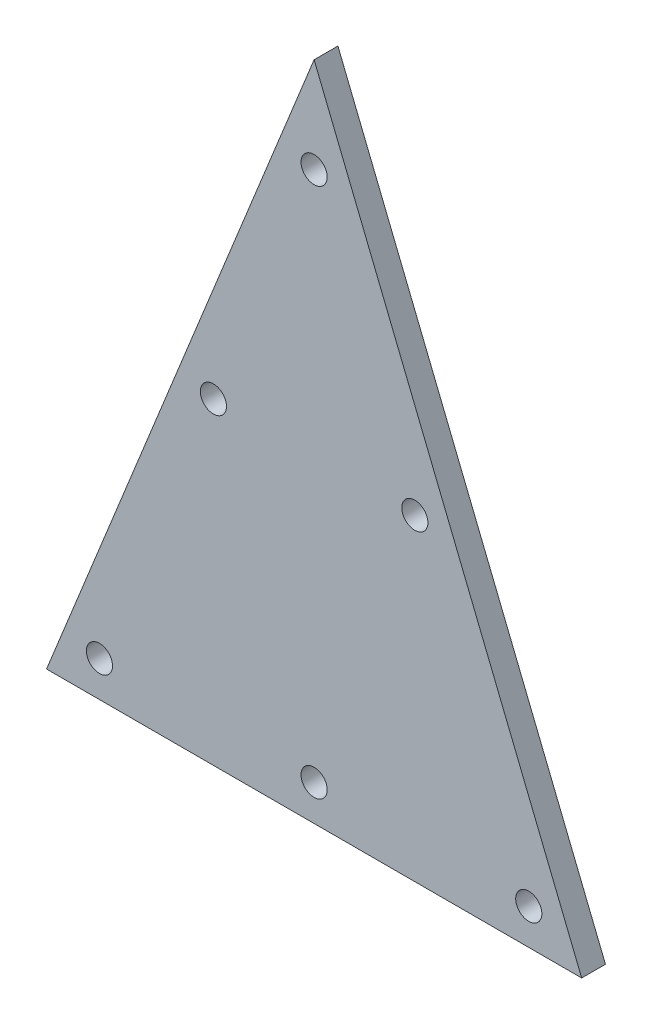
ISO-10303-21;
HEADER;
FILE_DESCRIPTION(('STEP AP214'),'2;1');
FILE_NAME('part.step','',(''),(''),'','','');
FILE_SCHEMA(('AUTOMOTIVE_DESIGN { 1 0 10303 214 1 1 1 1 }'));
ENDSEC;
DATA;
#1=APPLICATION_CONTEXT('core data for automotive mechanical design processes');
#2=APPLICATION_PROTOCOL_DEFINITION('international standard','automotive_design',2000,#1);
#3=PRODUCT_CONTEXT('',#1,'mechanical');
#4=PRODUCT('Part','Part','',(#3));
#5=PRODUCT_RELATED_PRODUCT_CATEGORY('part','',(#4));
#6=PRODUCT_DEFINITION_FORMATION('','',#4);
#7=PRODUCT_DEFINITION_CONTEXT('part definition',#1,'design');
#8=PRODUCT_DEFINITION('design','',#6,#7);
#9=PRODUCT_DEFINITION_SHAPE('','',#8);
#10=(LENGTH_UNIT() NAMED_UNIT(*) SI_UNIT(.MILLI.,.METRE.));
#11=(NAMED_UNIT(*) PLANE_ANGLE_UNIT() SI_UNIT($,.RADIAN.));
#12=(NAMED_UNIT(*) SI_UNIT($,.STERADIAN.) SOLID_ANGLE_UNIT());
#13=UNCERTAINTY_MEASURE_WITH_UNIT(LENGTH_MEASURE(1.E-05),#10,'distance_accuracy_value','');
#14=(GEOMETRIC_REPRESENTATION_CONTEXT(3) GLOBAL_UNCERTAINTY_ASSIGNED_CONTEXT((#13)) GLOBAL_UNIT_ASSIGNED_CONTEXT((#10,
#11,#12)) REPRESENTATION_CONTEXT('',''));
#15=CARTESIAN_POINT('',(0.,0.,0.));
#16=DIRECTION('',(0.,0.,1.));
#17=DIRECTION('',(1.,0.,0.));
#18=AXIS2_PLACEMENT_3D('',#15,#16,#17);
#19=CARTESIAN_POINT('',(0.,0.,2.));
#20=DIRECTION('',(0.,0.,1.));
#21=DIRECTION('',(1.,0.,0.));
#22=AXIS2_PLACEMENT_3D('',#19,#20,#21);
#23=PLANE('',#22);
#24=CARTESIAN_POINT('',(22.5,47.6214886532175,2.));
#25=DIRECTION('',(0.,0.,1.));
#26=DIRECTION('',(1.,0.,0.));
#27=AXIS2_PLACEMENT_3D('',#24,#25,#26);
#28=CIRCLE('',#27,1.1);
#29=CARTESIAN_POINT('',(23.6,47.6214886532175,2.));
#30=VERTEX_POINT('',#29);
#31=EDGE_CURVE('E118',#30,#30,#28,.T.);
#32=ORIENTED_EDGE('',*,*,#31,.F.);
#33=EDGE_LOOP('',(#32));
#34=FACE_BOUND('',#33,.T.);
#35=CARTESIAN_POINT('',(30.9689255673391,26.6857443266087,2.));
#36=DIRECTION('',(0.,0.,1.));
#37=DIRECTION('',(1.,0.,0.));
#38=AXIS2_PLACEMENT_3D('',#35,#36,#37);
#39=CIRCLE('',#38,1.1);
#40=CARTESIAN_POINT('',(32.0689255673391,26.6857443266087,2.));
#41=VERTEX_POINT('',#40);
#42=EDGE_CURVE('E128',#41,#41,#39,.T.);
#43=ORIENTED_EDGE('',*,*,#42,.F.);
#44=EDGE_LOOP('',(#43));
#45=FACE_BOUND('',#44,.T.);
#46=CARTESIAN_POINT('',(22.5,3.,2.));
#47=DIRECTION('',(0.,0.,1.));
#48=DIRECTION('',(1.,0.,0.));
#49=AXIS2_PLACEMENT_3D('',#46,#47,#48);
#50=CIRCLE('',#49,1.1);
#51=CARTESIAN_POINT('',(23.6,3.,2.));
#52=VERTEX_POINT('',#51);
#53=EDGE_CURVE('E85',#52,#52,#50,.T.);
#54=ORIENTED_EDGE('',*,*,#53,.F.);
#55=EDGE_LOOP('',(#54));
#56=FACE_BOUND('',#55,.T.);
#57=DIRECTION('',(-0.375,-0.927024810886958,0.));
#58=VECTOR('',#57,1.);
#59=CARTESIAN_POINT('',(22.5,55.6214886532175,2.));
#60=LINE('',#59,#58);
#61=CARTESIAN_POINT('',(22.5,55.6214886532175,2.));
#62=VERTEX_POINT('',#61);
#63=CARTESIAN_POINT('',(0.,0.,2.));
#64=VERTEX_POINT('',#63);
#65=EDGE_CURVE('E75',#62,#64,#60,.T.);
#66=ORIENTED_EDGE('',*,*,#65,.T.);
#67=DIRECTION('',(1.,0.,0.));
#68=VECTOR('',#67,1.);
#69=CARTESIAN_POINT('',(0.,0.,2.));
#70=LINE('',#69,#68);
#71=CARTESIAN_POINT('',(45.,0.,2.));
#72=VERTEX_POINT('',#71);
#73=EDGE_CURVE('E71',#64,#72,#70,.T.);
#74=ORIENTED_EDGE('',*,*,#73,.T.);
#75=DIRECTION('',(-0.375,0.927024810886958,0.));
#76=VECTOR('',#75,1.);
#77=CARTESIAN_POINT('',(45.,0.,2.));
#78=LINE('',#77,#76);
#79=EDGE_CURVE('E51',#72,#62,#78,.T.);
#80=ORIENTED_EDGE('',*,*,#79,.T.);
#81=EDGE_LOOP('',(#66,#74,#80));
#82=FACE_BOUND('',#81,.T.);
#83=CARTESIAN_POINT('',(14.0310744326609,26.6857443266087,2.));
#84=DIRECTION('',(0.,0.,1.));
#85=DIRECTION('',(1.,0.,0.));
#86=AXIS2_PLACEMENT_3D('',#83,#84,#85);
#87=CIRCLE('',#86,1.1);
#88=CARTESIAN_POINT('',(15.1310744326609,26.6857443266087,2.));
#89=VERTEX_POINT('',#88);
#90=EDGE_CURVE('E133',#89,#89,#87,.T.);
#91=ORIENTED_EDGE('',*,*,#90,.F.);
#92=EDGE_LOOP('',(#91));
#93=FACE_BOUND('',#92,.T.);
#94=CARTESIAN_POINT('',(4.4497190922574,3.,2.));
#95=DIRECTION('',(0.,0.,1.));
#96=DIRECTION('',(1.,0.,0.));
#97=AXIS2_PLACEMENT_3D('',#94,#95,#96);
#98=CIRCLE('',#97,1.1);
#99=CARTESIAN_POINT('',(5.5497190922574,3.,2.));
#100=VERTEX_POINT('',#99);
#101=EDGE_CURVE('E123',#100,#100,#98,.T.);
#102=ORIENTED_EDGE('',*,*,#101,.F.);
#103=EDGE_LOOP('',(#102));
#104=FACE_BOUND('',#103,.T.);
#105=CARTESIAN_POINT('',(40.5502809077426,3.,2.));
#106=DIRECTION('',(0.,0.,1.));
#107=DIRECTION('',(1.,0.,0.));
#108=AXIS2_PLACEMENT_3D('',#105,#106,#107);
#109=CIRCLE('',#108,1.1);
#110=CARTESIAN_POINT('',(41.6502809077426,3.,2.));
#111=VERTEX_POINT('',#110);
#112=EDGE_CURVE('E112',#111,#111,#109,.T.);
#113=ORIENTED_EDGE('',*,*,#112,.F.);
#114=EDGE_LOOP('',(#113));
#115=FACE_BOUND('',#114,.T.);
#116=ADVANCED_FACE('F34',(#34,#45,#56,#82,#93,#104,#115),#23,.T.);
#117=CARTESIAN_POINT('',(0.,0.,0.));
#118=DIRECTION('',(0.,0.,1.));
#119=DIRECTION('',(1.,0.,0.));
#120=AXIS2_PLACEMENT_3D('',#117,#118,#119);
#121=PLANE('',#120);
#122=CARTESIAN_POINT('',(22.5,47.6214886532175,0.));
#123=DIRECTION('',(0.,0.,1.));
#124=DIRECTION('',(1.,0.,0.));
#125=AXIS2_PLACEMENT_3D('',#122,#123,#124);
#126=CIRCLE('',#125,1.1);
#127=CARTESIAN_POINT('',(23.6,47.6214886532175,0.));
#128=VERTEX_POINT('',#127);
#129=EDGE_CURVE('E115',#128,#128,#126,.T.);
#130=ORIENTED_EDGE('',*,*,#129,.T.);
#131=EDGE_LOOP('',(#130));
#132=FACE_BOUND('',#131,.T.);
#133=CARTESIAN_POINT('',(30.9689255673391,26.6857443266087,0.));
#134=DIRECTION('',(0.,0.,1.));
#135=DIRECTION('',(1.,0.,0.));
#136=AXIS2_PLACEMENT_3D('',#133,#134,#135);
#137=CIRCLE('',#136,1.1);
#138=CARTESIAN_POINT('',(32.0689255673391,26.6857443266087,0.));
#139=VERTEX_POINT('',#138);
#140=EDGE_CURVE('E126',#139,#139,#137,.T.);
#141=ORIENTED_EDGE('',*,*,#140,.T.);
#142=EDGE_LOOP('',(#141));
#143=FACE_BOUND('',#142,.T.);
#144=CARTESIAN_POINT('',(22.5,3.,0.));
#145=DIRECTION('',(0.,0.,1.));
#146=DIRECTION('',(1.,0.,0.));
#147=AXIS2_PLACEMENT_3D('',#144,#145,#146);
#148=CIRCLE('',#147,1.1);
#149=CARTESIAN_POINT('',(23.6,3.,0.));
#150=VERTEX_POINT('',#149);
#151=EDGE_CURVE('E89',#150,#150,#148,.T.);
#152=ORIENTED_EDGE('',*,*,#151,.T.);
#153=EDGE_LOOP('',(#152));
#154=FACE_BOUND('',#153,.T.);
#155=DIRECTION('',(-0.375,-0.927024810886958,0.));
#156=VECTOR('',#155,1.);
#157=CARTESIAN_POINT('',(22.5,55.6214886532175,0.));
#158=LINE('',#157,#156);
#159=CARTESIAN_POINT('',(22.5,55.6214886532175,0.));
#160=VERTEX_POINT('',#159);
#161=CARTESIAN_POINT('',(0.,0.,0.));
#162=VERTEX_POINT('',#161);
#163=EDGE_CURVE('E82',#160,#162,#158,.T.);
#164=ORIENTED_EDGE('',*,*,#163,.F.);
#165=DIRECTION('',(-0.375,0.927024810886958,0.));
#166=VECTOR('',#165,1.);
#167=CARTESIAN_POINT('',(45.,0.,0.));
#168=LINE('',#167,#166);
#169=CARTESIAN_POINT('',(45.,0.,0.));
#170=VERTEX_POINT('',#169);
#171=EDGE_CURVE('E68',#170,#160,#168,.T.);
#172=ORIENTED_EDGE('',*,*,#171,.F.);
#173=DIRECTION('',(1.,0.,0.));
#174=VECTOR('',#173,1.);
#175=CARTESIAN_POINT('',(0.,0.,0.));
#176=LINE('',#175,#174);
#177=EDGE_CURVE('E63',#162,#170,#176,.T.);
#178=ORIENTED_EDGE('',*,*,#177,.F.);
#179=EDGE_LOOP('',(#164,#172,#178));
#180=FACE_BOUND('',#179,.T.);
#181=CARTESIAN_POINT('',(14.0310744326609,26.6857443266087,0.));
#182=DIRECTION('',(0.,0.,1.));
#183=DIRECTION('',(1.,0.,0.));
#184=AXIS2_PLACEMENT_3D('',#181,#182,#183);
#185=CIRCLE('',#184,1.1);
#186=CARTESIAN_POINT('',(15.1310744326609,26.6857443266087,0.));
#187=VERTEX_POINT('',#186);
#188=EDGE_CURVE('E103',#187,#187,#185,.T.);
#189=ORIENTED_EDGE('',*,*,#188,.T.);
#190=EDGE_LOOP('',(#189));
#191=FACE_BOUND('',#190,.T.);
#192=CARTESIAN_POINT('',(4.4497190922574,3.,0.));
#193=DIRECTION('',(0.,0.,1.));
#194=DIRECTION('',(1.,0.,0.));
#195=AXIS2_PLACEMENT_3D('',#192,#193,#194);
#196=CIRCLE('',#195,1.1);
#197=CARTESIAN_POINT('',(5.5497190922574,3.,0.));
#198=VERTEX_POINT('',#197);
#199=EDGE_CURVE('E107',#198,#198,#196,.T.);
#200=ORIENTED_EDGE('',*,*,#199,.T.);
#201=EDGE_LOOP('',(#200));
#202=FACE_BOUND('',#201,.T.);
#203=CARTESIAN_POINT('',(40.5502809077426,3.,0.));
#204=DIRECTION('',(0.,0.,1.));
#205=DIRECTION('',(1.,0.,0.));
#206=AXIS2_PLACEMENT_3D('',#203,#204,#205);
#207=CIRCLE('',#206,1.1);
#208=CARTESIAN_POINT('',(41.6502809077426,3.,0.));
#209=VERTEX_POINT('',#208);
#210=EDGE_CURVE('E110',#209,#209,#207,.T.);
#211=ORIENTED_EDGE('',*,*,#210,.T.);
#212=EDGE_LOOP('',(#211));
#213=FACE_BOUND('',#212,.T.);
#214=ADVANCED_FACE('F95',(#132,#143,#154,#180,#191,#202,#213),#121,.F.);
#215=CARTESIAN_POINT('',(22.5,55.6214886532175,2.));
#216=DIRECTION('',(0.927024810886958,-0.375,0.));
#217=DIRECTION('',(0.375,0.927024810886958,0.));
#218=AXIS2_PLACEMENT_3D('',#215,#216,#217);
#219=PLANE('',#218);
#220=ORIENTED_EDGE('',*,*,#163,.T.);
#221=DIRECTION('',(0.,0.,-1.));
#222=VECTOR('',#221,1.);
#223=CARTESIAN_POINT('',(0.,0.,2.));
#224=LINE('',#223,#222);
#225=EDGE_CURVE('E11',#64,#162,#224,.T.);
#226=ORIENTED_EDGE('',*,*,#225,.F.);
#227=ORIENTED_EDGE('',*,*,#65,.F.);
#228=DIRECTION('',(0.,0.,-1.));
#229=VECTOR('',#228,1.);
#230=CARTESIAN_POINT('',(22.5,55.6214886532175,2.));
#231=LINE('',#230,#229);
#232=EDGE_CURVE('E83',#62,#160,#231,.T.);
#233=ORIENTED_EDGE('',*,*,#232,.T.);
#234=EDGE_LOOP('',(#220,#226,#227,#233));
#235=FACE_BOUND('',#234,.T.);
#236=ADVANCED_FACE('F36',(#235),#219,.F.);
#237=CARTESIAN_POINT('',(0.,0.,2.));
#238=DIRECTION('',(0.,1.,0.));
#239=DIRECTION('',(0.,0.,1.));
#240=AXIS2_PLACEMENT_3D('',#237,#238,#239);
#241=PLANE('',#240);
#242=ORIENTED_EDGE('',*,*,#177,.T.);
#243=DIRECTION('',(0.,0.,-1.));
#244=VECTOR('',#243,1.);
#245=CARTESIAN_POINT('',(45.,0.,2.));
#246=LINE('',#245,#244);
#247=EDGE_CURVE('E43',#72,#170,#246,.T.);
#248=ORIENTED_EDGE('',*,*,#247,.F.);
#249=ORIENTED_EDGE('',*,*,#73,.F.);
#250=ORIENTED_EDGE('',*,*,#225,.T.);
#251=EDGE_LOOP('',(#242,#248,#249,#250));
#252=FACE_BOUND('',#251,.T.);
#253=ADVANCED_FACE('F72',(#252),#241,.F.);
#254=CARTESIAN_POINT('',(45.,0.,2.));
#255=DIRECTION('',(-0.927024810886958,-0.375,0.));
#256=DIRECTION('',(0.375,-0.927024810886958,0.));
#257=AXIS2_PLACEMENT_3D('',#254,#255,#256);
#258=PLANE('',#257);
#259=ORIENTED_EDGE('',*,*,#171,.T.);
#260=ORIENTED_EDGE('',*,*,#232,.F.);
#261=ORIENTED_EDGE('',*,*,#79,.F.);
#262=ORIENTED_EDGE('',*,*,#247,.T.);
#263=EDGE_LOOP('',(#259,#260,#261,#262));
#264=FACE_BOUND('',#263,.T.);
#265=ADVANCED_FACE('F94',(#264),#258,.F.);
#266=CARTESIAN_POINT('',(22.5,3.,2.));
#267=DIRECTION('',(0.,0.,-1.));
#268=DIRECTION('',(-1.,0.,0.));
#269=AXIS2_PLACEMENT_3D('',#266,#267,#268);
#270=CYLINDRICAL_SURFACE('',#269,1.1);
#271=ORIENTED_EDGE('',*,*,#53,.T.);
#272=EDGE_LOOP('',(#271));
#273=FACE_BOUND('',#272,.T.);
#274=ORIENTED_EDGE('',*,*,#151,.F.);
#275=EDGE_LOOP('',(#274));
#276=FACE_BOUND('',#275,.T.);
#277=ADVANCED_FACE('F141',(#273,#276),#270,.F.);
#278=CARTESIAN_POINT('',(14.0310744326609,26.6857443266087,2.));
#279=DIRECTION('',(0.,0.,-1.));
#280=DIRECTION('',(-1.,0.,0.));
#281=AXIS2_PLACEMENT_3D('',#278,#279,#280);
#282=CYLINDRICAL_SURFACE('',#281,1.1);
#283=ORIENTED_EDGE('',*,*,#90,.T.);
#284=EDGE_LOOP('',(#283));
#285=FACE_BOUND('',#284,.T.);
#286=ORIENTED_EDGE('',*,*,#188,.F.);
#287=EDGE_LOOP('',(#286));
#288=FACE_BOUND('',#287,.T.);
#289=ADVANCED_FACE('F143',(#285,#288),#282,.F.);
#290=CARTESIAN_POINT('',(30.9689255673391,26.6857443266087,2.));
#291=DIRECTION('',(0.,0.,-1.));
#292=DIRECTION('',(-1.,0.,0.));
#293=AXIS2_PLACEMENT_3D('',#290,#291,#292);
#294=CYLINDRICAL_SURFACE('',#293,1.1);
#295=ORIENTED_EDGE('',*,*,#42,.T.);
#296=EDGE_LOOP('',(#295));
#297=FACE_BOUND('',#296,.T.);
#298=ORIENTED_EDGE('',*,*,#140,.F.);
#299=EDGE_LOOP('',(#298));
#300=FACE_BOUND('',#299,.T.);
#301=ADVANCED_FACE('F150',(#297,#300),#294,.F.);
#302=CARTESIAN_POINT('',(4.4497190922574,3.,2.));
#303=DIRECTION('',(0.,0.,-1.));
#304=DIRECTION('',(-1.,0.,0.));
#305=AXIS2_PLACEMENT_3D('',#302,#303,#304);
#306=CYLINDRICAL_SURFACE('',#305,1.1);
#307=ORIENTED_EDGE('',*,*,#101,.T.);
#308=EDGE_LOOP('',(#307));
#309=FACE_BOUND('',#308,.T.);
#310=ORIENTED_EDGE('',*,*,#199,.F.);
#311=EDGE_LOOP('',(#310));
#312=FACE_BOUND('',#311,.T.);
#313=ADVANCED_FACE('F207',(#309,#312),#306,.F.);
#314=CARTESIAN_POINT('',(22.5,47.6214886532175,2.));
#315=DIRECTION('',(0.,0.,-1.));
#316=DIRECTION('',(-1.,0.,0.));
#317=AXIS2_PLACEMENT_3D('',#314,#315,#316);
#318=CYLINDRICAL_SURFACE('',#317,1.1);
#319=ORIENTED_EDGE('',*,*,#31,.T.);
#320=EDGE_LOOP('',(#319));
#321=FACE_BOUND('',#320,.T.);
#322=ORIENTED_EDGE('',*,*,#129,.F.);
#323=EDGE_LOOP('',(#322));
#324=FACE_BOUND('',#323,.T.);
#325=ADVANCED_FACE('F216',(#321,#324),#318,.F.);
#326=CARTESIAN_POINT('',(40.5502809077426,3.,2.));
#327=DIRECTION('',(0.,0.,-1.));
#328=DIRECTION('',(-1.,0.,0.));
#329=AXIS2_PLACEMENT_3D('',#326,#327,#328);
#330=CYLINDRICAL_SURFACE('',#329,1.1);
#331=ORIENTED_EDGE('',*,*,#112,.T.);
#332=EDGE_LOOP('',(#331));
#333=FACE_BOUND('',#332,.T.);
#334=ORIENTED_EDGE('',*,*,#210,.F.);
#335=EDGE_LOOP('',(#334));
#336=FACE_BOUND('',#335,.T.);
#337=ADVANCED_FACE('F225',(#333,#336),#330,.F.);
#338=CLOSED_SHELL('',(#116,#214,#236,#253,#265,#277,#289,#301,#313,#325,#337));
#339=MANIFOLD_SOLID_BREP('B2',#338);
#340=ADVANCED_BREP_SHAPE_REPRESENTATION('',(#18,#339),#14);
#341=SHAPE_DEFINITION_REPRESENTATION(#9,#340);
ENDSEC;
END-ISO-10303-21;
